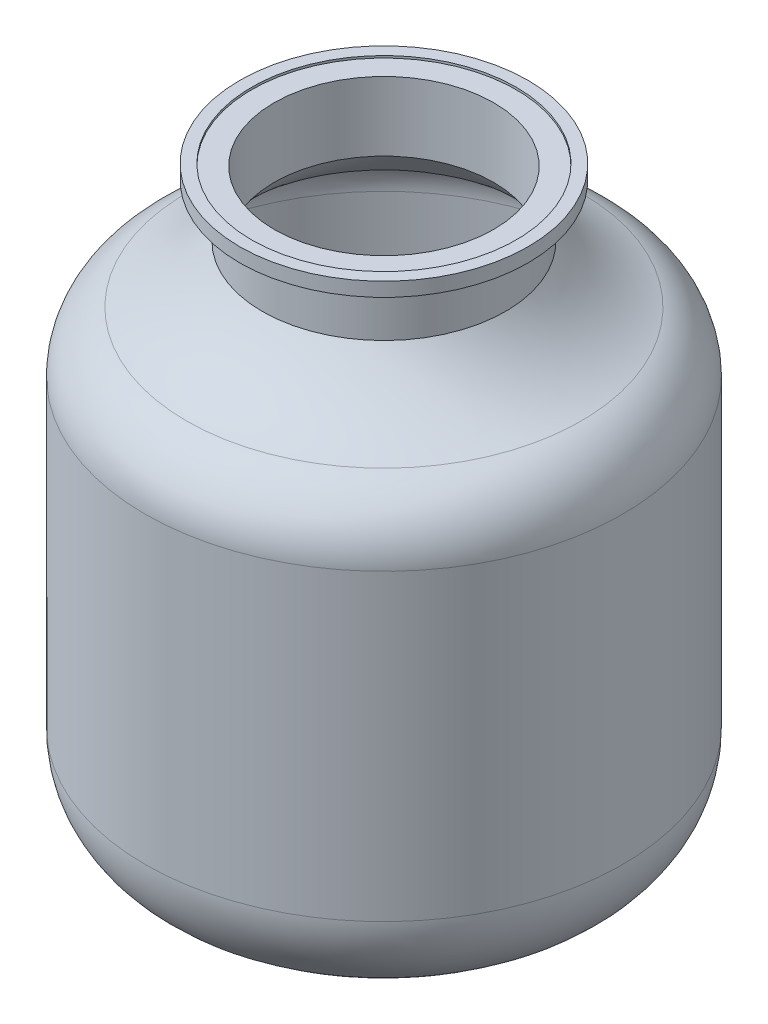
ISO-10303-21;
HEADER;
FILE_DESCRIPTION(('STEP AP214'),'2;1');
FILE_NAME('part.step','',(''),(''),'','','');
FILE_SCHEMA(('AUTOMOTIVE_DESIGN { 1 0 10303 214 1 1 1 1 }'));
ENDSEC;
DATA;
#1=APPLICATION_CONTEXT('core data for automotive mechanical design processes');
#2=APPLICATION_PROTOCOL_DEFINITION('international standard','automotive_design',2000,#1);
#3=PRODUCT_CONTEXT('',#1,'mechanical');
#4=PRODUCT('Part','Part','',(#3));
#5=PRODUCT_RELATED_PRODUCT_CATEGORY('part','',(#4));
#6=PRODUCT_DEFINITION_FORMATION('','',#4);
#7=PRODUCT_DEFINITION_CONTEXT('part definition',#1,'design');
#8=PRODUCT_DEFINITION('design','',#6,#7);
#9=PRODUCT_DEFINITION_SHAPE('','',#8);
#10=(LENGTH_UNIT() NAMED_UNIT(*) SI_UNIT(.MILLI.,.METRE.));
#11=(NAMED_UNIT(*) PLANE_ANGLE_UNIT() SI_UNIT($,.RADIAN.));
#12=(NAMED_UNIT(*) SI_UNIT($,.STERADIAN.) SOLID_ANGLE_UNIT());
#13=UNCERTAINTY_MEASURE_WITH_UNIT(LENGTH_MEASURE(1.E-05),#10,'distance_accuracy_value','');
#14=(GEOMETRIC_REPRESENTATION_CONTEXT(3) GLOBAL_UNCERTAINTY_ASSIGNED_CONTEXT((#13)) GLOBAL_UNIT_ASSIGNED_CONTEXT((#10,
#11,#12)) REPRESENTATION_CONTEXT('',''));
#15=CARTESIAN_POINT('',(0.,0.,0.));
#16=DIRECTION('',(0.,0.,1.));
#17=DIRECTION('',(1.,0.,0.));
#18=AXIS2_PLACEMENT_3D('',#15,#16,#17);
#19=CARTESIAN_POINT('',(0.,15.9683633199807,0.));
#20=DIRECTION('',(0.,1.,0.));
#21=DIRECTION('',(0.,0.,1.));
#22=AXIS2_PLACEMENT_3D('',#19,#20,#21);
#23=TOROIDAL_SURFACE('',#22,24.3601458454961,15.9683633199807);
#24=CARTESIAN_POINT('',(0.,15.9683633199807,0.));
#25=DIRECTION('',(0.,1.,0.));
#26=DIRECTION('',(0.,0.,1.));
#27=AXIS2_PLACEMENT_3D('',#24,#25,#26);
#28=CIRCLE('',#27,40.3285091654769);
#29=CARTESIAN_POINT('',(0.,15.9683633199807,40.3285091654769));
#30=VERTEX_POINT('',#29);
#31=EDGE_CURVE('E10',#30,#30,#28,.T.);
#32=ORIENTED_EDGE('',*,*,#31,.F.);
#33=EDGE_LOOP('',(#32));
#34=FACE_BOUND('',#33,.T.);
#35=CARTESIAN_POINT('',(0.,0.,0.));
#36=DIRECTION('',(0.,1.,0.));
#37=DIRECTION('',(0.,0.,1.));
#38=AXIS2_PLACEMENT_3D('',#35,#36,#37);
#39=CIRCLE('',#38,24.3601458454961);
#40=CARTESIAN_POINT('',(0.,0.,24.3601458454961));
#41=VERTEX_POINT('',#40);
#42=EDGE_CURVE('E67',#41,#41,#39,.T.);
#43=ORIENTED_EDGE('',*,*,#42,.T.);
#44=EDGE_LOOP('',(#43));
#45=FACE_BOUND('',#44,.T.);
#46=ADVANCED_FACE('F32',(#34,#45),#23,.T.);
#47=CARTESIAN_POINT('',(0.,98.3939694275288,0.));
#48=DIRECTION('',(0.,1.,0.));
#49=DIRECTION('',(0.,0.,1.));
#50=AXIS2_PLACEMENT_3D('',#47,#48,#49);
#51=CYLINDRICAL_SURFACE('',#50,40.3285091654769);
#52=CARTESIAN_POINT('',(0.,67.2301662901291,0.));
#53=DIRECTION('',(0.,1.,0.));
#54=DIRECTION('',(0.,0.,1.));
#55=AXIS2_PLACEMENT_3D('',#52,#53,#54);
#56=CIRCLE('',#55,40.3285091654769);
#57=CARTESIAN_POINT('',(0.,67.2301662901291,40.3285091654769));
#58=VERTEX_POINT('',#57);
#59=EDGE_CURVE('E38',#58,#58,#56,.T.);
#60=ORIENTED_EDGE('',*,*,#59,.F.);
#61=EDGE_LOOP('',(#60));
#62=FACE_BOUND('',#61,.T.);
#63=ORIENTED_EDGE('',*,*,#31,.T.);
#64=EDGE_LOOP('',(#63));
#65=FACE_BOUND('',#64,.T.);
#66=ADVANCED_FACE('F109',(#62,#65),#51,.T.);
#67=CARTESIAN_POINT('',(0.,67.2301662901291,0.));
#68=DIRECTION('',(0.,1.,0.));
#69=DIRECTION('',(0.,0.,1.));
#70=AXIS2_PLACEMENT_3D('',#67,#68,#69);
#71=TOROIDAL_SURFACE('',#70,29.4459217443869,10.88258742109);
#72=CARTESIAN_POINT('',(0.,77.3888781381647,0.));
#73=DIRECTION('',(0.,1.,0.));
#74=DIRECTION('',(0.,0.,1.));
#75=AXIS2_PLACEMENT_3D('',#72,#73,#74);
#76=CIRCLE('',#75,33.3486493247142);
#77=CARTESIAN_POINT('',(0.,77.3888781381647,33.3486493247142));
#78=VERTEX_POINT('',#77);
#79=EDGE_CURVE('E42',#78,#78,#76,.T.);
#80=ORIENTED_EDGE('',*,*,#79,.F.);
#81=EDGE_LOOP('',(#80));
#82=FACE_BOUND('',#81,.T.);
#83=ORIENTED_EDGE('',*,*,#59,.T.);
#84=EDGE_LOOP('',(#83));
#85=FACE_BOUND('',#84,.T.);
#86=ADVANCED_FACE('F114',(#82,#85),#71,.T.);
#87=CARTESIAN_POINT('',(0.,104.560398181296,0.));
#88=DIRECTION('',(0.,1.,0.));
#89=DIRECTION('',(0.,0.,1.));
#90=AXIS2_PLACEMENT_3D('',#87,#88,#89);
#91=TOROIDAL_SURFACE('',#90,43.7872799560426,29.1076709977213);
#92=CARTESIAN_POINT('',(0.,87.0227921881738,0.));
#93=DIRECTION('',(0.,1.,0.));
#94=DIRECTION('',(0.,0.,1.));
#95=AXIS2_PLACEMENT_3D('',#92,#93,#94);
#96=CIRCLE('',#95,20.5560749304398);
#97=CARTESIAN_POINT('',(0.,87.0227921881738,20.5560749304398));
#98=VERTEX_POINT('',#97);
#99=EDGE_CURVE('E46',#98,#98,#96,.T.);
#100=ORIENTED_EDGE('',*,*,#99,.F.);
#101=EDGE_LOOP('',(#100));
#102=FACE_BOUND('',#101,.T.);
#103=ORIENTED_EDGE('',*,*,#79,.T.);
#104=EDGE_LOOP('',(#103));
#105=FACE_BOUND('',#104,.T.);
#106=ADVANCED_FACE('F119',(#102,#105),#91,.F.);
#107=CARTESIAN_POINT('',(0.,98.3939694275288,0.));
#108=DIRECTION('',(0.,1.,0.));
#109=DIRECTION('',(0.,0.,1.));
#110=AXIS2_PLACEMENT_3D('',#107,#108,#109);
#111=CYLINDRICAL_SURFACE('',#110,20.5560749304398);
#112=CARTESIAN_POINT('',(0.,96.0249741693299,0.));
#113=DIRECTION('',(0.,1.,0.));
#114=DIRECTION('',(0.,0.,1.));
#115=AXIS2_PLACEMENT_3D('',#112,#113,#114);
#116=CIRCLE('',#115,20.5560749304398);
#117=CARTESIAN_POINT('',(0.,96.0249741693299,20.5560749304398));
#118=VERTEX_POINT('',#117);
#119=EDGE_CURVE('E51',#118,#118,#116,.T.);
#120=ORIENTED_EDGE('',*,*,#119,.F.);
#121=EDGE_LOOP('',(#120));
#122=FACE_BOUND('',#121,.T.);
#123=ORIENTED_EDGE('',*,*,#99,.T.);
#124=EDGE_LOOP('',(#123));
#125=FACE_BOUND('',#124,.T.);
#126=ADVANCED_FACE('F125',(#122,#125),#111,.T.);
#127=CARTESIAN_POINT('',(20.5560749304398,96.0249741693299,0.));
#128=DIRECTION('',(0.,1.,0.));
#129=DIRECTION('',(0.,0.,1.));
#130=AXIS2_PLACEMENT_3D('',#127,#128,#129);
#131=PLANE('',#130);
#132=CARTESIAN_POINT('',(0.,96.0249741693299,0.));
#133=DIRECTION('',(0.,1.,0.));
#134=DIRECTION('',(0.,0.,1.));
#135=AXIS2_PLACEMENT_3D('',#132,#133,#134);
#136=CIRCLE('',#135,24.3601458454961);
#137=CARTESIAN_POINT('',(0.,96.0249741693299,24.3601458454961));
#138=VERTEX_POINT('',#137);
#139=EDGE_CURVE('E54',#138,#138,#136,.T.);
#140=ORIENTED_EDGE('',*,*,#139,.F.);
#141=EDGE_LOOP('',(#140));
#142=FACE_BOUND('',#141,.T.);
#143=ORIENTED_EDGE('',*,*,#119,.T.);
#144=EDGE_LOOP('',(#143));
#145=FACE_BOUND('',#144,.T.);
#146=ADVANCED_FACE('F129',(#142,#145),#131,.F.);
#147=CARTESIAN_POINT('',(0.,98.3939694275288,0.));
#148=DIRECTION('',(0.,1.,0.));
#149=DIRECTION('',(0.,0.,1.));
#150=AXIS2_PLACEMENT_3D('',#147,#148,#149);
#151=CYLINDRICAL_SURFACE('',#150,24.3601458454961);
#152=CARTESIAN_POINT('',(0.,98.3939694275288,0.));
#153=DIRECTION('',(0.,1.,0.));
#154=DIRECTION('',(0.,0.,1.));
#155=AXIS2_PLACEMENT_3D('',#152,#153,#154);
#156=CIRCLE('',#155,24.3601458454961);
#157=CARTESIAN_POINT('',(0.,98.3939694275288,24.3601458454961));
#158=VERTEX_POINT('',#157);
#159=EDGE_CURVE('E57',#158,#158,#156,.T.);
#160=ORIENTED_EDGE('',*,*,#159,.F.);
#161=EDGE_LOOP('',(#160));
#162=FACE_BOUND('',#161,.T.);
#163=ORIENTED_EDGE('',*,*,#139,.T.);
#164=EDGE_LOOP('',(#163));
#165=FACE_BOUND('',#164,.T.);
#166=ADVANCED_FACE('F133',(#162,#165),#151,.T.);
#167=CARTESIAN_POINT('',(24.3601458454961,98.3939694275288,0.));
#168=DIRECTION('',(0.,-1.,0.));
#169=DIRECTION('',(0.,0.,-1.));
#170=AXIS2_PLACEMENT_3D('',#167,#168,#169);
#171=PLANE('',#170);
#172=CARTESIAN_POINT('',(0.,98.3939694275288,0.));
#173=DIRECTION('',(0.,-1.,0.));
#174=DIRECTION('',(0.,0.,-1.));
#175=AXIS2_PLACEMENT_3D('',#172,#173,#174);
#176=CIRCLE('',#175,22.3601458454961);
#177=CARTESIAN_POINT('',(0.,98.3939694275288,-22.3601458454961));
#178=VERTEX_POINT('',#177);
#179=EDGE_CURVE('E61',#178,#178,#176,.F.);
#180=ORIENTED_EDGE('',*,*,#179,.F.);
#181=EDGE_LOOP('',(#180));
#182=FACE_BOUND('',#181,.T.);
#183=ORIENTED_EDGE('',*,*,#159,.T.);
#184=EDGE_LOOP('',(#183));
#185=FACE_BOUND('',#184,.T.);
#186=ADVANCED_FACE('F93',(#182,#185),#171,.F.);
#187=CARTESIAN_POINT('',(0.,0.,0.));
#188=DIRECTION('',(0.,1.,0.));
#189=DIRECTION('',(0.,0.,1.));
#190=AXIS2_PLACEMENT_3D('',#187,#188,#189);
#191=CYLINDRICAL_SURFACE('',#190,24.3601458454961);
#192=ORIENTED_EDGE('',*,*,#42,.F.);
#193=EDGE_LOOP('',(#192));
#194=FACE_BOUND('',#193,.T.);
#195=CARTESIAN_POINT('',(0.,2.,0.));
#196=DIRECTION('',(0.,1.,0.));
#197=DIRECTION('',(0.,0.,1.));
#198=AXIS2_PLACEMENT_3D('',#195,#196,#197);
#199=CIRCLE('',#198,24.3601458454961);
#200=CARTESIAN_POINT('',(0.,2.,24.3601458454961));
#201=VERTEX_POINT('',#200);
#202=EDGE_CURVE('E60',#201,#201,#199,.T.);
#203=ORIENTED_EDGE('',*,*,#202,.T.);
#204=EDGE_LOOP('',(#203));
#205=FACE_BOUND('',#204,.T.);
#206=ADVANCED_FACE('F89',(#194,#205),#191,.F.);
#207=CARTESIAN_POINT('',(0.,15.9683633199807,0.));
#208=DIRECTION('',(0.,1.,0.));
#209=DIRECTION('',(0.,0.,1.));
#210=AXIS2_PLACEMENT_3D('',#207,#208,#209);
#211=TOROIDAL_SURFACE('',#210,24.3601458454961,13.9683633199807);
#212=CARTESIAN_POINT('',(0.,15.9683633199807,0.));
#213=DIRECTION('',(0.,1.,0.));
#214=DIRECTION('',(0.,0.,1.));
#215=AXIS2_PLACEMENT_3D('',#212,#213,#214);
#216=CIRCLE('',#215,38.3285091654769);
#217=CARTESIAN_POINT('',(0.,15.9683633199807,38.3285091654769));
#218=VERTEX_POINT('',#217);
#219=EDGE_CURVE('E82',#218,#218,#216,.T.);
#220=ORIENTED_EDGE('',*,*,#219,.T.);
#221=EDGE_LOOP('',(#220));
#222=FACE_BOUND('',#221,.T.);
#223=ORIENTED_EDGE('',*,*,#202,.F.);
#224=EDGE_LOOP('',(#223));
#225=FACE_BOUND('',#224,.T.);
#226=ADVANCED_FACE('F92',(#222,#225),#211,.F.);
#227=CARTESIAN_POINT('',(0.,98.3939694275288,0.));
#228=DIRECTION('',(0.,1.,0.));
#229=DIRECTION('',(0.,0.,1.));
#230=AXIS2_PLACEMENT_3D('',#227,#228,#229);
#231=CYLINDRICAL_SURFACE('',#230,38.3285091654769);
#232=CARTESIAN_POINT('',(0.,67.2301662901291,0.));
#233=DIRECTION('',(0.,1.,0.));
#234=DIRECTION('',(0.,0.,1.));
#235=AXIS2_PLACEMENT_3D('',#232,#233,#234);
#236=CIRCLE('',#235,38.3285091654769);
#237=CARTESIAN_POINT('',(0.,67.2301662901291,38.3285091654769));
#238=VERTEX_POINT('',#237);
#239=EDGE_CURVE('E79',#238,#238,#236,.T.);
#240=ORIENTED_EDGE('',*,*,#239,.T.);
#241=EDGE_LOOP('',(#240));
#242=FACE_BOUND('',#241,.T.);
#243=ORIENTED_EDGE('',*,*,#219,.F.);
#244=EDGE_LOOP('',(#243));
#245=FACE_BOUND('',#244,.T.);
#246=ADVANCED_FACE('F98',(#242,#245),#231,.F.);
#247=CARTESIAN_POINT('',(0.,67.2301662901291,0.));
#248=DIRECTION('',(0.,1.,0.));
#249=DIRECTION('',(0.,0.,1.));
#250=AXIS2_PLACEMENT_3D('',#247,#248,#249);
#251=TOROIDAL_SURFACE('',#250,29.4459217443869,8.88258742108998);
#252=CARTESIAN_POINT('',(0.,75.5219118635179,0.));
#253=DIRECTION('',(0.,1.,0.));
#254=DIRECTION('',(0.,0.,1.));
#255=AXIS2_PLACEMENT_3D('',#252,#253,#254);
#256=CIRCLE('',#255,32.6314067372089);
#257=CARTESIAN_POINT('',(0.,75.5219118635179,32.6314067372089));
#258=VERTEX_POINT('',#257);
#259=EDGE_CURVE('E76',#258,#258,#256,.T.);
#260=ORIENTED_EDGE('',*,*,#259,.T.);
#261=EDGE_LOOP('',(#260));
#262=FACE_BOUND('',#261,.T.);
#263=ORIENTED_EDGE('',*,*,#239,.F.);
#264=EDGE_LOOP('',(#263));
#265=FACE_BOUND('',#264,.T.);
#266=ADVANCED_FACE('F105',(#262,#265),#251,.F.);
#267=CARTESIAN_POINT('',(0.,104.560398181296,0.));
#268=DIRECTION('',(0.,1.,0.));
#269=DIRECTION('',(0.,0.,1.));
#270=AXIS2_PLACEMENT_3D('',#267,#268,#269);
#271=TOROIDAL_SURFACE('',#270,43.7872799560426,31.1076709977213);
#272=CARTESIAN_POINT('',(0.,86.3649732657171,0.));
#273=DIRECTION('',(0.,1.,0.));
#274=DIRECTION('',(0.,0.,1.));
#275=AXIS2_PLACEMENT_3D('',#272,#273,#274);
#276=CIRCLE('',#275,18.5560749304398);
#277=CARTESIAN_POINT('',(0.,86.3649732657171,18.5560749304398));
#278=VERTEX_POINT('',#277);
#279=EDGE_CURVE('E73',#278,#278,#276,.T.);
#280=ORIENTED_EDGE('',*,*,#279,.T.);
#281=EDGE_LOOP('',(#280));
#282=FACE_BOUND('',#281,.T.);
#283=ORIENTED_EDGE('',*,*,#259,.F.);
#284=EDGE_LOOP('',(#283));
#285=FACE_BOUND('',#284,.T.);
#286=ADVANCED_FACE('F152',(#282,#285),#271,.T.);
#287=CARTESIAN_POINT('',(0.,98.3939694275288,0.));
#288=DIRECTION('',(0.,1.,0.));
#289=DIRECTION('',(0.,0.,1.));
#290=AXIS2_PLACEMENT_3D('',#287,#288,#289);
#291=CYLINDRICAL_SURFACE('',#290,18.5560749304398);
#292=CARTESIAN_POINT('',(0.,98.0249741693299,0.));
#293=DIRECTION('',(0.,1.,0.));
#294=DIRECTION('',(0.,0.,1.));
#295=AXIS2_PLACEMENT_3D('',#292,#293,#294);
#296=CIRCLE('',#295,18.5560749304398);
#297=CARTESIAN_POINT('',(0.,98.0249741693299,18.5560749304398));
#298=VERTEX_POINT('',#297);
#299=EDGE_CURVE('E70',#298,#298,#296,.T.);
#300=ORIENTED_EDGE('',*,*,#299,.T.);
#301=EDGE_LOOP('',(#300));
#302=FACE_BOUND('',#301,.T.);
#303=ORIENTED_EDGE('',*,*,#279,.F.);
#304=EDGE_LOOP('',(#303));
#305=FACE_BOUND('',#304,.T.);
#306=ADVANCED_FACE('F148',(#302,#305),#291,.F.);
#307=CARTESIAN_POINT('',(20.5560749304398,98.0249741693299,0.));
#308=DIRECTION('',(0.,1.,0.));
#309=DIRECTION('',(0.,0.,1.));
#310=AXIS2_PLACEMENT_3D('',#307,#308,#309);
#311=PLANE('',#310);
#312=CARTESIAN_POINT('',(0.,98.0249741693299,0.));
#313=DIRECTION('',(0.,1.,0.));
#314=DIRECTION('',(0.,0.,1.));
#315=AXIS2_PLACEMENT_3D('',#312,#313,#314);
#316=CIRCLE('',#315,22.3601458454961);
#317=CARTESIAN_POINT('',(0.,98.0249741693299,22.3601458454961));
#318=VERTEX_POINT('',#317);
#319=EDGE_CURVE('E64',#318,#318,#316,.T.);
#320=ORIENTED_EDGE('',*,*,#319,.T.);
#321=EDGE_LOOP('',(#320));
#322=FACE_BOUND('',#321,.T.);
#323=ORIENTED_EDGE('',*,*,#299,.F.);
#324=EDGE_LOOP('',(#323));
#325=FACE_BOUND('',#324,.T.);
#326=ADVANCED_FACE('F144',(#322,#325),#311,.T.);
#327=CARTESIAN_POINT('',(0.,98.3939694275288,0.));
#328=DIRECTION('',(0.,1.,0.));
#329=DIRECTION('',(0.,0.,1.));
#330=AXIS2_PLACEMENT_3D('',#327,#328,#329);
#331=CYLINDRICAL_SURFACE('',#330,22.3601458454961);
#332=ORIENTED_EDGE('',*,*,#179,.T.);
#333=EDGE_LOOP('',(#332));
#334=FACE_BOUND('',#333,.T.);
#335=ORIENTED_EDGE('',*,*,#319,.F.);
#336=EDGE_LOOP('',(#335));
#337=FACE_BOUND('',#336,.T.);
#338=ADVANCED_FACE('F141',(#334,#337),#331,.F.);
#339=CLOSED_SHELL('',(#46,#66,#86,#106,#126,#146,#166,#186,#206,#226,#246,#266,#286,#306,#326,#338));
#340=MANIFOLD_SOLID_BREP('B2',#339);
#341=ADVANCED_BREP_SHAPE_REPRESENTATION('',(#18,#340),#14);
#342=SHAPE_DEFINITION_REPRESENTATION(#9,#341);
ENDSEC;
END-ISO-10303-21;
